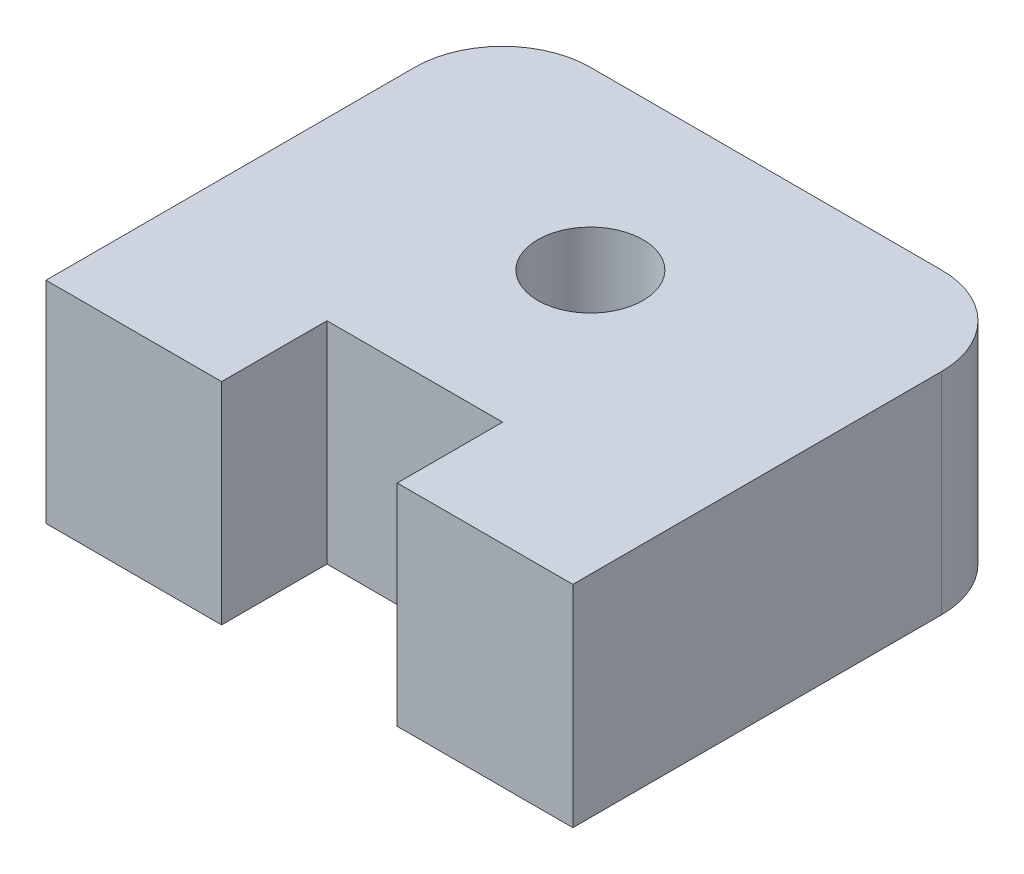
ISO-10303-21;
HEADER;
FILE_DESCRIPTION(('STEP AP214'),'2;1');
FILE_NAME('part.step','',(''),(''),'','','');
FILE_SCHEMA(('AUTOMOTIVE_DESIGN { 1 0 10303 214 1 1 1 1 }'));
ENDSEC;
DATA;
#1=APPLICATION_CONTEXT('core data for automotive mechanical design processes');
#2=APPLICATION_PROTOCOL_DEFINITION('international standard','automotive_design',2000,#1);
#3=PRODUCT_CONTEXT('',#1,'mechanical');
#4=PRODUCT('Part','Part','',(#3));
#5=PRODUCT_RELATED_PRODUCT_CATEGORY('part','',(#4));
#6=PRODUCT_DEFINITION_FORMATION('','',#4);
#7=PRODUCT_DEFINITION_CONTEXT('part definition',#1,'design');
#8=PRODUCT_DEFINITION('design','',#6,#7);
#9=PRODUCT_DEFINITION_SHAPE('','',#8);
#10=(LENGTH_UNIT() NAMED_UNIT(*) SI_UNIT(.MILLI.,.METRE.));
#11=(NAMED_UNIT(*) PLANE_ANGLE_UNIT() SI_UNIT($,.RADIAN.));
#12=(NAMED_UNIT(*) SI_UNIT($,.STERADIAN.) SOLID_ANGLE_UNIT());
#13=UNCERTAINTY_MEASURE_WITH_UNIT(LENGTH_MEASURE(1.E-05),#10,'distance_accuracy_value','');
#14=(GEOMETRIC_REPRESENTATION_CONTEXT(3) GLOBAL_UNCERTAINTY_ASSIGNED_CONTEXT((#13)) GLOBAL_UNIT_ASSIGNED_CONTEXT((#10,
#11,#12)) REPRESENTATION_CONTEXT('',''));
#15=CARTESIAN_POINT('',(0.,0.,0.));
#16=DIRECTION('',(0.,0.,1.));
#17=DIRECTION('',(1.,0.,0.));
#18=AXIS2_PLACEMENT_3D('',#15,#16,#17);
#19=CARTESIAN_POINT('',(2.5,6.,-10.5));
#20=DIRECTION('',(0.,-1.,0.));
#21=DIRECTION('',(0.,0.,-1.));
#22=AXIS2_PLACEMENT_3D('',#19,#20,#21);
#23=PLANE('',#22);
#24=DIRECTION('',(1.,0.,0.));
#25=VECTOR('',#24,1.);
#26=CARTESIAN_POINT('',(5.,6.,0.));
#27=LINE('',#26,#25);
#28=CARTESIAN_POINT('',(0.,6.,0.));
#29=VERTEX_POINT('',#28);
#30=CARTESIAN_POINT('',(5.,6.,0.));
#31=VERTEX_POINT('',#30);
#32=EDGE_CURVE('E161',#29,#31,#27,.T.);
#33=ORIENTED_EDGE('',*,*,#32,.T.);
#34=DIRECTION('',(0.,0.,-1.));
#35=VECTOR('',#34,1.);
#36=CARTESIAN_POINT('',(5.,6.,-3.));
#37=LINE('',#36,#35);
#38=CARTESIAN_POINT('',(5.,6.,-3.));
#39=VERTEX_POINT('',#38);
#40=EDGE_CURVE('E99',#31,#39,#37,.T.);
#41=ORIENTED_EDGE('',*,*,#40,.T.);
#42=DIRECTION('',(1.,0.,0.));
#43=VECTOR('',#42,1.);
#44=CARTESIAN_POINT('',(10.,6.,-3.));
#45=LINE('',#44,#43);
#46=CARTESIAN_POINT('',(10.,6.,-3.));
#47=VERTEX_POINT('',#46);
#48=EDGE_CURVE('E182',#39,#47,#45,.T.);
#49=ORIENTED_EDGE('',*,*,#48,.T.);
#50=DIRECTION('',(0.,0.,1.));
#51=VECTOR('',#50,1.);
#52=CARTESIAN_POINT('',(10.,6.,0.));
#53=LINE('',#52,#51);
#54=CARTESIAN_POINT('',(10.,6.,0.));
#55=VERTEX_POINT('',#54);
#56=EDGE_CURVE('E201',#47,#55,#53,.T.);
#57=ORIENTED_EDGE('',*,*,#56,.T.);
#58=DIRECTION('',(1.,0.,0.));
#59=VECTOR('',#58,1.);
#60=CARTESIAN_POINT('',(15.,6.,0.));
#61=LINE('',#60,#59);
#62=CARTESIAN_POINT('',(15.,6.,0.));
#63=VERTEX_POINT('',#62);
#64=EDGE_CURVE('E198',#55,#63,#61,.T.);
#65=ORIENTED_EDGE('',*,*,#64,.T.);
#66=DIRECTION('',(0.,0.,-1.));
#67=VECTOR('',#66,1.);
#68=CARTESIAN_POINT('',(15.,6.,-10.5));
#69=LINE('',#68,#67);
#70=CARTESIAN_POINT('',(15.,6.,-10.5));
#71=VERTEX_POINT('',#70);
#72=EDGE_CURVE('E200',#63,#71,#69,.T.);
#73=ORIENTED_EDGE('',*,*,#72,.T.);
#74=CARTESIAN_POINT('',(12.5,6.,-10.5));
#75=DIRECTION('',(0.,1.,0.));
#76=DIRECTION('',(0.,0.,-1.));
#77=AXIS2_PLACEMENT_3D('',#74,#75,#76);
#78=CIRCLE('',#77,2.5);
#79=CARTESIAN_POINT('',(12.5,6.,-13.));
#80=VERTEX_POINT('',#79);
#81=EDGE_CURVE('E124',#71,#80,#78,.T.);
#82=ORIENTED_EDGE('',*,*,#81,.T.);
#83=DIRECTION('',(-1.,0.,0.));
#84=VECTOR('',#83,1.);
#85=CARTESIAN_POINT('',(2.50000000000002,6.,-13.));
#86=LINE('',#85,#84);
#87=CARTESIAN_POINT('',(2.5,6.,-13.));
#88=VERTEX_POINT('',#87);
#89=EDGE_CURVE('E118',#80,#88,#86,.T.);
#90=ORIENTED_EDGE('',*,*,#89,.T.);
#91=CARTESIAN_POINT('',(2.5,6.,-10.5));
#92=DIRECTION('',(0.,1.,0.));
#93=DIRECTION('',(0.,0.,-1.));
#94=AXIS2_PLACEMENT_3D('',#91,#92,#93);
#95=CIRCLE('',#94,2.5);
#96=CARTESIAN_POINT('',(0.,6.,-10.5));
#97=VERTEX_POINT('',#96);
#98=EDGE_CURVE('E122',#88,#97,#95,.T.);
#99=ORIENTED_EDGE('',*,*,#98,.T.);
#100=DIRECTION('',(0.,0.,1.));
#101=VECTOR('',#100,1.);
#102=CARTESIAN_POINT('',(0.,6.,0.));
#103=LINE('',#102,#101);
#104=EDGE_CURVE('E50',#97,#29,#103,.T.);
#105=ORIENTED_EDGE('',*,*,#104,.T.);
#106=EDGE_LOOP('',(#33,#41,#49,#57,#65,#73,#82,#90,#99,#105));
#107=FACE_BOUND('',#106,.T.);
#108=CARTESIAN_POINT('',(7.5,6.,-8.));
#109=DIRECTION('',(0.,1.,0.));
#110=DIRECTION('',(0.,0.,1.));
#111=AXIS2_PLACEMENT_3D('',#108,#109,#110);
#112=CIRCLE('',#111,1.5);
#113=CARTESIAN_POINT('',(7.5,6.,-6.5));
#114=VERTEX_POINT('',#113);
#115=EDGE_CURVE('E146',#114,#114,#112,.T.);
#116=ORIENTED_EDGE('',*,*,#115,.F.);
#117=EDGE_LOOP('',(#116));
#118=FACE_BOUND('',#117,.T.);
#119=ADVANCED_FACE('F33',(#107,#118),#23,.F.);
#120=CARTESIAN_POINT('',(2.5,0.,-10.5));
#121=DIRECTION('',(0.,-1.,0.));
#122=DIRECTION('',(0.,0.,-1.));
#123=AXIS2_PLACEMENT_3D('',#120,#121,#122);
#124=PLANE('',#123);
#125=DIRECTION('',(1.,0.,0.));
#126=VECTOR('',#125,1.);
#127=CARTESIAN_POINT('',(5.,0.,0.));
#128=LINE('',#127,#126);
#129=CARTESIAN_POINT('',(0.,0.,0.));
#130=VERTEX_POINT('',#129);
#131=CARTESIAN_POINT('',(5.,0.,0.));
#132=VERTEX_POINT('',#131);
#133=EDGE_CURVE('E142',#130,#132,#128,.T.);
#134=ORIENTED_EDGE('',*,*,#133,.F.);
#135=DIRECTION('',(0.,0.,1.));
#136=VECTOR('',#135,1.);
#137=CARTESIAN_POINT('',(0.,0.,0.));
#138=LINE('',#137,#136);
#139=CARTESIAN_POINT('',(0.,0.,-10.5));
#140=VERTEX_POINT('',#139);
#141=EDGE_CURVE('E91',#140,#130,#138,.T.);
#142=ORIENTED_EDGE('',*,*,#141,.F.);
#143=CARTESIAN_POINT('',(2.5,0.,-10.5));
#144=DIRECTION('',(0.,1.,0.));
#145=DIRECTION('',(0.,0.,-1.));
#146=AXIS2_PLACEMENT_3D('',#143,#144,#145);
#147=CIRCLE('',#146,2.5);
#148=CARTESIAN_POINT('',(2.5,0.,-13.));
#149=VERTEX_POINT('',#148);
#150=EDGE_CURVE('E85',#149,#140,#147,.T.);
#151=ORIENTED_EDGE('',*,*,#150,.F.);
#152=DIRECTION('',(-1.,0.,0.));
#153=VECTOR('',#152,1.);
#154=CARTESIAN_POINT('',(2.50000000000002,0.,-13.));
#155=LINE('',#154,#153);
#156=CARTESIAN_POINT('',(12.5,0.,-13.));
#157=VERTEX_POINT('',#156);
#158=EDGE_CURVE('E132',#157,#149,#155,.T.);
#159=ORIENTED_EDGE('',*,*,#158,.F.);
#160=CARTESIAN_POINT('',(12.5,0.,-10.5));
#161=DIRECTION('',(0.,1.,0.));
#162=DIRECTION('',(0.,0.,-1.));
#163=AXIS2_PLACEMENT_3D('',#160,#161,#162);
#164=CIRCLE('',#163,2.5);
#165=CARTESIAN_POINT('',(15.,0.,-10.5));
#166=VERTEX_POINT('',#165);
#167=EDGE_CURVE('E156',#166,#157,#164,.T.);
#168=ORIENTED_EDGE('',*,*,#167,.F.);
#169=DIRECTION('',(0.,0.,-1.));
#170=VECTOR('',#169,1.);
#171=CARTESIAN_POINT('',(15.,0.,-10.5));
#172=LINE('',#171,#170);
#173=CARTESIAN_POINT('',(15.,0.,0.));
#174=VERTEX_POINT('',#173);
#175=EDGE_CURVE('E154',#174,#166,#172,.T.);
#176=ORIENTED_EDGE('',*,*,#175,.F.);
#177=DIRECTION('',(1.,0.,0.));
#178=VECTOR('',#177,1.);
#179=CARTESIAN_POINT('',(15.,0.,0.));
#180=LINE('',#179,#178);
#181=CARTESIAN_POINT('',(10.,0.,0.));
#182=VERTEX_POINT('',#181);
#183=EDGE_CURVE('E152',#182,#174,#180,.T.);
#184=ORIENTED_EDGE('',*,*,#183,.F.);
#185=DIRECTION('',(0.,0.,1.));
#186=VECTOR('',#185,1.);
#187=CARTESIAN_POINT('',(10.,0.,0.));
#188=LINE('',#187,#186);
#189=CARTESIAN_POINT('',(10.,0.,-3.));
#190=VERTEX_POINT('',#189);
#191=EDGE_CURVE('E150',#190,#182,#188,.T.);
#192=ORIENTED_EDGE('',*,*,#191,.F.);
#193=DIRECTION('',(1.,0.,0.));
#194=VECTOR('',#193,1.);
#195=CARTESIAN_POINT('',(10.,0.,-3.));
#196=LINE('',#195,#194);
#197=CARTESIAN_POINT('',(5.,0.,-3.));
#198=VERTEX_POINT('',#197);
#199=EDGE_CURVE('E148',#198,#190,#196,.T.);
#200=ORIENTED_EDGE('',*,*,#199,.F.);
#201=DIRECTION('',(0.,0.,-1.));
#202=VECTOR('',#201,1.);
#203=CARTESIAN_POINT('',(5.,0.,-3.));
#204=LINE('',#203,#202);
#205=EDGE_CURVE('E145',#132,#198,#204,.T.);
#206=ORIENTED_EDGE('',*,*,#205,.F.);
#207=EDGE_LOOP('',(#134,#142,#151,#159,#168,#176,#184,#192,#200,#206));
#208=FACE_BOUND('',#207,.T.);
#209=CARTESIAN_POINT('',(7.5,0.,-8.));
#210=DIRECTION('',(0.,1.,0.));
#211=DIRECTION('',(0.,0.,1.));
#212=AXIS2_PLACEMENT_3D('',#209,#210,#211);
#213=CIRCLE('',#212,1.5);
#214=CARTESIAN_POINT('',(7.5,0.,-6.5));
#215=VERTEX_POINT('',#214);
#216=EDGE_CURVE('E209',#215,#215,#213,.T.);
#217=ORIENTED_EDGE('',*,*,#216,.T.);
#218=EDGE_LOOP('',(#217));
#219=FACE_BOUND('',#218,.T.);
#220=ADVANCED_FACE('F186',(#208,#219),#124,.T.);
#221=CARTESIAN_POINT('',(5.,6.,0.));
#222=DIRECTION('',(0.,0.,-1.));
#223=DIRECTION('',(-1.,0.,0.));
#224=AXIS2_PLACEMENT_3D('',#221,#222,#223);
#225=PLANE('',#224);
#226=ORIENTED_EDGE('',*,*,#133,.T.);
#227=DIRECTION('',(0.,-1.,0.));
#228=VECTOR('',#227,1.);
#229=CARTESIAN_POINT('',(5.,6.,0.));
#230=LINE('',#229,#228);
#231=EDGE_CURVE('E11',#31,#132,#230,.T.);
#232=ORIENTED_EDGE('',*,*,#231,.F.);
#233=ORIENTED_EDGE('',*,*,#32,.F.);
#234=DIRECTION('',(0.,-1.,0.));
#235=VECTOR('',#234,1.);
#236=CARTESIAN_POINT('',(0.,6.,0.));
#237=LINE('',#236,#235);
#238=EDGE_CURVE('E138',#29,#130,#237,.T.);
#239=ORIENTED_EDGE('',*,*,#238,.T.);
#240=EDGE_LOOP('',(#226,#232,#233,#239));
#241=FACE_BOUND('',#240,.T.);
#242=ADVANCED_FACE('F35',(#241),#225,.F.);
#243=CARTESIAN_POINT('',(5.,6.,-3.));
#244=DIRECTION('',(-1.,0.,0.));
#245=DIRECTION('',(0.,0.,1.));
#246=AXIS2_PLACEMENT_3D('',#243,#244,#245);
#247=PLANE('',#246);
#248=ORIENTED_EDGE('',*,*,#205,.T.);
#249=DIRECTION('',(0.,-1.,0.));
#250=VECTOR('',#249,1.);
#251=CARTESIAN_POINT('',(5.,6.,-3.));
#252=LINE('',#251,#250);
#253=EDGE_CURVE('E42',#39,#198,#252,.T.);
#254=ORIENTED_EDGE('',*,*,#253,.F.);
#255=ORIENTED_EDGE('',*,*,#40,.F.);
#256=ORIENTED_EDGE('',*,*,#231,.T.);
#257=EDGE_LOOP('',(#248,#254,#255,#256));
#258=FACE_BOUND('',#257,.T.);
#259=ADVANCED_FACE('F245',(#258),#247,.F.);
#260=CARTESIAN_POINT('',(10.,6.,-3.));
#261=DIRECTION('',(0.,0.,-1.));
#262=DIRECTION('',(-1.,0.,0.));
#263=AXIS2_PLACEMENT_3D('',#260,#261,#262);
#264=PLANE('',#263);
#265=ORIENTED_EDGE('',*,*,#199,.T.);
#266=DIRECTION('',(0.,-1.,0.));
#267=VECTOR('',#266,1.);
#268=CARTESIAN_POINT('',(10.,6.,-3.));
#269=LINE('',#268,#267);
#270=EDGE_CURVE('E174',#47,#190,#269,.T.);
#271=ORIENTED_EDGE('',*,*,#270,.F.);
#272=ORIENTED_EDGE('',*,*,#48,.F.);
#273=ORIENTED_EDGE('',*,*,#253,.T.);
#274=EDGE_LOOP('',(#265,#271,#272,#273));
#275=FACE_BOUND('',#274,.T.);
#276=ADVANCED_FACE('F180',(#275),#264,.F.);
#277=CARTESIAN_POINT('',(10.,6.,0.));
#278=DIRECTION('',(1.,0.,0.));
#279=DIRECTION('',(0.,0.,-1.));
#280=AXIS2_PLACEMENT_3D('',#277,#278,#279);
#281=PLANE('',#280);
#282=ORIENTED_EDGE('',*,*,#191,.T.);
#283=DIRECTION('',(0.,-1.,0.));
#284=VECTOR('',#283,1.);
#285=CARTESIAN_POINT('',(10.,6.,0.));
#286=LINE('',#285,#284);
#287=EDGE_CURVE('E171',#55,#182,#286,.T.);
#288=ORIENTED_EDGE('',*,*,#287,.F.);
#289=ORIENTED_EDGE('',*,*,#56,.F.);
#290=ORIENTED_EDGE('',*,*,#270,.T.);
#291=EDGE_LOOP('',(#282,#288,#289,#290));
#292=FACE_BOUND('',#291,.T.);
#293=ADVANCED_FACE('F192',(#292),#281,.F.);
#294=CARTESIAN_POINT('',(15.,6.,0.));
#295=DIRECTION('',(0.,0.,-1.));
#296=DIRECTION('',(-1.,0.,0.));
#297=AXIS2_PLACEMENT_3D('',#294,#295,#296);
#298=PLANE('',#297);
#299=ORIENTED_EDGE('',*,*,#183,.T.);
#300=DIRECTION('',(0.,-1.,0.));
#301=VECTOR('',#300,1.);
#302=CARTESIAN_POINT('',(15.,6.,0.));
#303=LINE('',#302,#301);
#304=EDGE_CURVE('E168',#63,#174,#303,.T.);
#305=ORIENTED_EDGE('',*,*,#304,.F.);
#306=ORIENTED_EDGE('',*,*,#64,.F.);
#307=ORIENTED_EDGE('',*,*,#287,.T.);
#308=EDGE_LOOP('',(#299,#305,#306,#307));
#309=FACE_BOUND('',#308,.T.);
#310=ADVANCED_FACE('F196',(#309),#298,.F.);
#311=CARTESIAN_POINT('',(15.,6.,-10.5));
#312=DIRECTION('',(-1.,0.,0.));
#313=DIRECTION('',(0.,0.,1.));
#314=AXIS2_PLACEMENT_3D('',#311,#312,#313);
#315=PLANE('',#314);
#316=ORIENTED_EDGE('',*,*,#175,.T.);
#317=DIRECTION('',(0.,-1.,0.));
#318=VECTOR('',#317,1.);
#319=CARTESIAN_POINT('',(15.,6.,-10.5));
#320=LINE('',#319,#318);
#321=EDGE_CURVE('E165',#71,#166,#320,.T.);
#322=ORIENTED_EDGE('',*,*,#321,.F.);
#323=ORIENTED_EDGE('',*,*,#72,.F.);
#324=ORIENTED_EDGE('',*,*,#304,.T.);
#325=EDGE_LOOP('',(#316,#322,#323,#324));
#326=FACE_BOUND('',#325,.T.);
#327=ADVANCED_FACE('F235',(#326),#315,.F.);
#328=CARTESIAN_POINT('',(12.5,6.,-10.5));
#329=DIRECTION('',(0.,-1.,0.));
#330=DIRECTION('',(0.,0.,-1.));
#331=AXIS2_PLACEMENT_3D('',#328,#329,#330);
#332=CYLINDRICAL_SURFACE('',#331,2.5);
#333=ORIENTED_EDGE('',*,*,#167,.T.);
#334=DIRECTION('',(0.,-1.,0.));
#335=VECTOR('',#334,1.);
#336=CARTESIAN_POINT('',(12.5,6.,-13.));
#337=LINE('',#336,#335);
#338=EDGE_CURVE('E133',#80,#157,#337,.T.);
#339=ORIENTED_EDGE('',*,*,#338,.F.);
#340=ORIENTED_EDGE('',*,*,#81,.F.);
#341=ORIENTED_EDGE('',*,*,#321,.T.);
#342=EDGE_LOOP('',(#333,#339,#340,#341));
#343=FACE_BOUND('',#342,.T.);
#344=ADVANCED_FACE('F232',(#343),#332,.T.);
#345=CARTESIAN_POINT('',(2.50000000000002,6.,-13.));
#346=DIRECTION('',(0.,0.,1.));
#347=DIRECTION('',(1.,0.,0.));
#348=AXIS2_PLACEMENT_3D('',#345,#346,#347);
#349=PLANE('',#348);
#350=ORIENTED_EDGE('',*,*,#158,.T.);
#351=DIRECTION('',(0.,-1.,0.));
#352=VECTOR('',#351,1.);
#353=CARTESIAN_POINT('',(2.5,6.,-13.));
#354=LINE('',#353,#352);
#355=EDGE_CURVE('E129',#88,#149,#354,.T.);
#356=ORIENTED_EDGE('',*,*,#355,.F.);
#357=ORIENTED_EDGE('',*,*,#89,.F.);
#358=ORIENTED_EDGE('',*,*,#338,.T.);
#359=EDGE_LOOP('',(#350,#356,#357,#358));
#360=FACE_BOUND('',#359,.T.);
#361=ADVANCED_FACE('F130',(#360),#349,.F.);
#362=CARTESIAN_POINT('',(2.5,6.,-10.5));
#363=DIRECTION('',(0.,-1.,0.));
#364=DIRECTION('',(0.,0.,-1.));
#365=AXIS2_PLACEMENT_3D('',#362,#363,#364);
#366=CYLINDRICAL_SURFACE('',#365,2.5);
#367=ORIENTED_EDGE('',*,*,#150,.T.);
#368=DIRECTION('',(0.,-1.,0.));
#369=VECTOR('',#368,1.);
#370=CARTESIAN_POINT('',(0.,6.,-10.5));
#371=LINE('',#370,#369);
#372=EDGE_CURVE('E134',#97,#140,#371,.T.);
#373=ORIENTED_EDGE('',*,*,#372,.F.);
#374=ORIENTED_EDGE('',*,*,#98,.F.);
#375=ORIENTED_EDGE('',*,*,#355,.T.);
#376=EDGE_LOOP('',(#367,#373,#374,#375));
#377=FACE_BOUND('',#376,.T.);
#378=ADVANCED_FACE('F136',(#377),#366,.T.);
#379=CARTESIAN_POINT('',(0.,6.,0.));
#380=DIRECTION('',(1.,0.,0.));
#381=DIRECTION('',(0.,0.,-1.));
#382=AXIS2_PLACEMENT_3D('',#379,#380,#381);
#383=PLANE('',#382);
#384=ORIENTED_EDGE('',*,*,#141,.T.);
#385=ORIENTED_EDGE('',*,*,#238,.F.);
#386=ORIENTED_EDGE('',*,*,#104,.F.);
#387=ORIENTED_EDGE('',*,*,#372,.T.);
#388=EDGE_LOOP('',(#384,#385,#386,#387));
#389=FACE_BOUND('',#388,.T.);
#390=ADVANCED_FACE('F225',(#389),#383,.F.);
#391=CARTESIAN_POINT('',(7.5,6.,-8.));
#392=DIRECTION('',(0.,-1.,0.));
#393=DIRECTION('',(0.,0.,-1.));
#394=AXIS2_PLACEMENT_3D('',#391,#392,#393);
#395=CYLINDRICAL_SURFACE('',#394,1.5);
#396=ORIENTED_EDGE('',*,*,#115,.T.);
#397=EDGE_LOOP('',(#396));
#398=FACE_BOUND('',#397,.T.);
#399=ORIENTED_EDGE('',*,*,#216,.F.);
#400=EDGE_LOOP('',(#399));
#401=FACE_BOUND('',#400,.T.);
#402=ADVANCED_FACE('F215',(#398,#401),#395,.F.);
#403=CLOSED_SHELL('',(#119,#220,#242,#259,#276,#293,#310,#327,#344,#361,#378,#390,#402));
#404=MANIFOLD_SOLID_BREP('B2',#403);
#405=ADVANCED_BREP_SHAPE_REPRESENTATION('',(#18,#404),#14);
#406=SHAPE_DEFINITION_REPRESENTATION(#9,#405);
ENDSEC;
END-ISO-10303-21;
